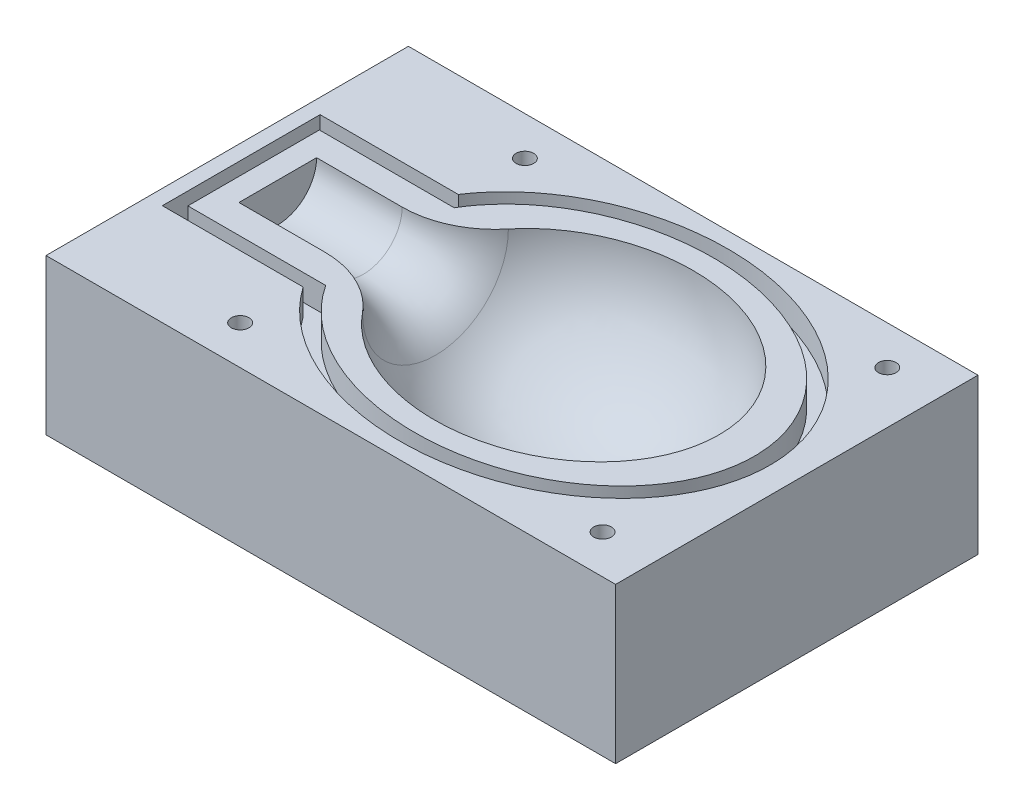
ISO-10303-21;
HEADER;
FILE_DESCRIPTION(('STEP AP214'),'2;1');
FILE_NAME('part.step','',(''),(''),'','','');
FILE_SCHEMA(('AUTOMOTIVE_DESIGN { 1 0 10303 214 1 1 1 1 }'));
ENDSEC;
DATA;
#1=APPLICATION_CONTEXT('core data for automotive mechanical design processes');
#2=APPLICATION_PROTOCOL_DEFINITION('international standard','automotive_design',2000,#1);
#3=PRODUCT_CONTEXT('',#1,'mechanical');
#4=PRODUCT('Part','Part','',(#3));
#5=PRODUCT_RELATED_PRODUCT_CATEGORY('part','',(#4));
#6=PRODUCT_DEFINITION_FORMATION('','',#4);
#7=PRODUCT_DEFINITION_CONTEXT('part definition',#1,'design');
#8=PRODUCT_DEFINITION('design','',#6,#7);
#9=PRODUCT_DEFINITION_SHAPE('','',#8);
#10=(LENGTH_UNIT() NAMED_UNIT(*) SI_UNIT(.MILLI.,.METRE.));
#11=(NAMED_UNIT(*) PLANE_ANGLE_UNIT() SI_UNIT($,.RADIAN.));
#12=(NAMED_UNIT(*) SI_UNIT($,.STERADIAN.) SOLID_ANGLE_UNIT());
#13=UNCERTAINTY_MEASURE_WITH_UNIT(LENGTH_MEASURE(1.E-05),#10,'distance_accuracy_value','');
#14=(GEOMETRIC_REPRESENTATION_CONTEXT(3) GLOBAL_UNCERTAINTY_ASSIGNED_CONTEXT((#13)) GLOBAL_UNIT_ASSIGNED_CONTEXT((#10,
#11,#12)) REPRESENTATION_CONTEXT('',''));
#15=CARTESIAN_POINT('',(0.,0.,0.));
#16=DIRECTION('',(0.,0.,1.));
#17=DIRECTION('',(1.,0.,0.));
#18=AXIS2_PLACEMENT_3D('',#15,#16,#17);
#19=CARTESIAN_POINT('',(-65.,15.,70.));
#20=DIRECTION('',(0.,-1.,0.));
#21=DIRECTION('',(0.,0.,-1.));
#22=AXIS2_PLACEMENT_3D('',#19,#20,#21);
#23=PLANE('',#22);
#24=CARTESIAN_POINT('',(-35.,15.,7.50000000000001));
#25=DIRECTION('',(0.,1.,0.));
#26=DIRECTION('',(0.,0.,1.));
#27=AXIS2_PLACEMENT_3D('',#24,#25,#26);
#28=CIRCLE('',#27,1.7);
#29=CARTESIAN_POINT('',(-35.,15.,9.20000000000001));
#30=VERTEX_POINT('',#29);
#31=EDGE_CURVE('E376',#30,#30,#28,.T.);
#32=ORIENTED_EDGE('',*,*,#31,.F.);
#33=EDGE_LOOP('',(#32));
#34=FACE_BOUND('',#33,.T.);
#35=CARTESIAN_POINT('',(-35.,15.,62.5));
#36=DIRECTION('',(0.,1.,0.));
#37=DIRECTION('',(0.,0.,1.));
#38=AXIS2_PLACEMENT_3D('',#35,#36,#37);
#39=CIRCLE('',#38,1.7);
#40=CARTESIAN_POINT('',(-35.,15.,64.2));
#41=VERTEX_POINT('',#40);
#42=EDGE_CURVE('E370',#41,#41,#39,.T.);
#43=ORIENTED_EDGE('',*,*,#42,.F.);
#44=EDGE_LOOP('',(#43));
#45=FACE_BOUND('',#44,.T.);
#46=CARTESIAN_POINT('',(35.,15.,62.5));
#47=DIRECTION('',(0.,1.,0.));
#48=DIRECTION('',(0.,0.,1.));
#49=AXIS2_PLACEMENT_3D('',#46,#47,#48);
#50=CIRCLE('',#49,1.7);
#51=CARTESIAN_POINT('',(35.,15.,64.2));
#52=VERTEX_POINT('',#51);
#53=EDGE_CURVE('E373',#52,#52,#50,.T.);
#54=ORIENTED_EDGE('',*,*,#53,.F.);
#55=EDGE_LOOP('',(#54));
#56=FACE_BOUND('',#55,.T.);
#57=CARTESIAN_POINT('',(35.,15.,7.50000000000001));
#58=DIRECTION('',(0.,1.,0.));
#59=DIRECTION('',(0.,0.,1.));
#60=AXIS2_PLACEMENT_3D('',#57,#58,#59);
#61=CIRCLE('',#60,1.7);
#62=CARTESIAN_POINT('',(35.,15.,9.20000000000001));
#63=VERTEX_POINT('',#62);
#64=EDGE_CURVE('E175',#63,#63,#61,.T.);
#65=ORIENTED_EDGE('',*,*,#64,.F.);
#66=EDGE_LOOP('',(#65));
#67=FACE_BOUND('',#66,.T.);
#68=CARTESIAN_POINT('',(-0.0005451086669871,15.,34.9611842694005));
#69=DIRECTION('',(0.,1.,0.));
#70=DIRECTION('',(0.999945324283841,0.,0.0104569805816109));
#71=AXIS2_PLACEMENT_3D('',#68,#69,#70);
#72=ELLIPSE('',#71,40.,31.9289069454393);
#73=CARTESIAN_POINT('',(-34.8996353722282,15.,50.4303053997574));
#74=VERTEX_POINT('',#73);
#75=CARTESIAN_POINT('',(-35.4015133834347,15.,19.9632950449526));
#76=VERTEX_POINT('',#75);
#77=EDGE_CURVE('E301',#74,#76,#72,.T.);
#78=ORIENTED_EDGE('',*,*,#77,.F.);
#79=DIRECTION('',(1.,0.,0.));
#80=VECTOR('',#79,1.);
#81=CARTESIAN_POINT('',(0.,15.,50.4303053997574));
#82=LINE('',#81,#80);
#83=CARTESIAN_POINT('',(-62.0942792060646,15.,50.4303053997575));
#84=VERTEX_POINT('',#83);
#85=EDGE_CURVE('E51',#84,#74,#82,.T.);
#86=ORIENTED_EDGE('',*,*,#85,.F.);
#87=DIRECTION('',(0.,0.,1.));
#88=VECTOR('',#87,1.);
#89=CARTESIAN_POINT('',(-62.0942792060646,15.,0.));
#90=LINE('',#89,#88);
#91=CARTESIAN_POINT('',(-62.0942792060646,15.,19.9632950449526));
#92=VERTEX_POINT('',#91);
#93=EDGE_CURVE('E295',#92,#84,#90,.T.);
#94=ORIENTED_EDGE('',*,*,#93,.F.);
#95=DIRECTION('',(-1.,0.,0.));
#96=VECTOR('',#95,1.);
#97=CARTESIAN_POINT('',(0.,15.,19.9632950449526));
#98=LINE('',#97,#96);
#99=EDGE_CURVE('E298',#76,#92,#98,.T.);
#100=ORIENTED_EDGE('',*,*,#99,.F.);
#101=EDGE_LOOP('',(#78,#86,#94,#100));
#102=FACE_BOUND('',#101,.T.);
#103=DIRECTION('',(-1.,0.,0.));
#104=VECTOR('',#103,1.);
#105=CARTESIAN_POINT('',(-65.,15.,70.));
#106=LINE('',#105,#104);
#107=CARTESIAN_POINT('',(45.0269621580825,15.,70.));
#108=VERTEX_POINT('',#107);
#109=CARTESIAN_POINT('',(-65.,15.,70.));
#110=VERTEX_POINT('',#109);
#111=EDGE_CURVE('E221',#108,#110,#106,.T.);
#112=ORIENTED_EDGE('',*,*,#111,.F.);
#113=DIRECTION('',(0.,0.,-1.));
#114=VECTOR('',#113,1.);
#115=CARTESIAN_POINT('',(45.0269621580825,15.,70.));
#116=LINE('',#115,#114);
#117=CARTESIAN_POINT('',(45.0269621580825,15.,0.));
#118=VERTEX_POINT('',#117);
#119=EDGE_CURVE('E266',#108,#118,#116,.T.);
#120=ORIENTED_EDGE('',*,*,#119,.T.);
#121=DIRECTION('',(-1.,0.,0.));
#122=VECTOR('',#121,1.);
#123=CARTESIAN_POINT('',(-65.,15.,0.));
#124=LINE('',#123,#122);
#125=CARTESIAN_POINT('',(-65.,15.,0.));
#126=VERTEX_POINT('',#125);
#127=EDGE_CURVE('E218',#118,#126,#124,.T.);
#128=ORIENTED_EDGE('',*,*,#127,.T.);
#129=DIRECTION('',(0.,0.,-1.));
#130=VECTOR('',#129,1.);
#131=CARTESIAN_POINT('',(-65.,15.,70.));
#132=LINE('',#131,#130);
#133=EDGE_CURVE('E237',#110,#126,#132,.T.);
#134=ORIENTED_EDGE('',*,*,#133,.F.);
#135=EDGE_LOOP('',(#112,#120,#128,#134));
#136=FACE_BOUND('',#135,.T.);
#137=ADVANCED_FACE('F36',(#34,#45,#56,#67,#102,#136),#23,.F.);
#138=CARTESIAN_POINT('',(-65.,-15.,70.));
#139=DIRECTION('',(1.,0.,0.));
#140=DIRECTION('',(0.,0.,-1.));
#141=AXIS2_PLACEMENT_3D('',#138,#139,#140);
#142=PLANE('',#141);
#143=DIRECTION('',(0.,-1.,0.));
#144=VECTOR('',#143,1.);
#145=CARTESIAN_POINT('',(-65.,-15.,0.));
#146=LINE('',#145,#144);
#147=CARTESIAN_POINT('',(-65.,-15.,0.));
#148=VERTEX_POINT('',#147);
#149=EDGE_CURVE('E231',#126,#148,#146,.T.);
#150=ORIENTED_EDGE('',*,*,#149,.T.);
#151=DIRECTION('',(0.,0.,-1.));
#152=VECTOR('',#151,1.);
#153=CARTESIAN_POINT('',(-65.,-15.,70.));
#154=LINE('',#153,#152);
#155=CARTESIAN_POINT('',(-65.,-15.,70.));
#156=VERTEX_POINT('',#155);
#157=EDGE_CURVE('E229',#156,#148,#154,.T.);
#158=ORIENTED_EDGE('',*,*,#157,.F.);
#159=DIRECTION('',(0.,-1.,0.));
#160=VECTOR('',#159,1.);
#161=CARTESIAN_POINT('',(-65.,-15.,70.));
#162=LINE('',#161,#160);
#163=EDGE_CURVE('E223',#110,#156,#162,.T.);
#164=ORIENTED_EDGE('',*,*,#163,.F.);
#165=ORIENTED_EDGE('',*,*,#133,.T.);
#166=EDGE_LOOP('',(#150,#158,#164,#165));
#167=FACE_BOUND('',#166,.T.);
#168=ADVANCED_FACE('F330',(#167),#142,.F.);
#169=CARTESIAN_POINT('',(-65.,-15.,70.));
#170=DIRECTION('',(0.,1.,0.));
#171=DIRECTION('',(0.,0.,1.));
#172=AXIS2_PLACEMENT_3D('',#169,#170,#171);
#173=PLANE('',#172);
#174=CARTESIAN_POINT('',(-35.,-15.,7.50000000000001));
#175=DIRECTION('',(0.,1.,0.));
#176=DIRECTION('',(0.,0.,1.));
#177=AXIS2_PLACEMENT_3D('',#174,#175,#176);
#178=CIRCLE('',#177,1.7);
#179=CARTESIAN_POINT('',(-35.,-15.,9.20000000000001));
#180=VERTEX_POINT('',#179);
#181=EDGE_CURVE('E371',#180,#180,#178,.T.);
#182=ORIENTED_EDGE('',*,*,#181,.T.);
#183=EDGE_LOOP('',(#182));
#184=FACE_BOUND('',#183,.T.);
#185=CARTESIAN_POINT('',(-35.,-15.,62.5));
#186=DIRECTION('',(0.,1.,0.));
#187=DIRECTION('',(0.,0.,1.));
#188=AXIS2_PLACEMENT_3D('',#185,#186,#187);
#189=CIRCLE('',#188,1.7);
#190=CARTESIAN_POINT('',(-35.,-15.,64.2));
#191=VERTEX_POINT('',#190);
#192=EDGE_CURVE('E367',#191,#191,#189,.T.);
#193=ORIENTED_EDGE('',*,*,#192,.T.);
#194=EDGE_LOOP('',(#193));
#195=FACE_BOUND('',#194,.T.);
#196=CARTESIAN_POINT('',(35.,-15.,62.5));
#197=DIRECTION('',(0.,1.,0.));
#198=DIRECTION('',(0.,0.,1.));
#199=AXIS2_PLACEMENT_3D('',#196,#197,#198);
#200=CIRCLE('',#199,1.7);
#201=CARTESIAN_POINT('',(35.,-15.,64.2));
#202=VERTEX_POINT('',#201);
#203=EDGE_CURVE('E384',#202,#202,#200,.T.);
#204=ORIENTED_EDGE('',*,*,#203,.T.);
#205=EDGE_LOOP('',(#204));
#206=FACE_BOUND('',#205,.T.);
#207=CARTESIAN_POINT('',(35.,-15.,7.50000000000001));
#208=DIRECTION('',(0.,1.,0.));
#209=DIRECTION('',(0.,0.,1.));
#210=AXIS2_PLACEMENT_3D('',#207,#208,#209);
#211=CIRCLE('',#210,1.7);
#212=CARTESIAN_POINT('',(35.,-15.,9.20000000000001));
#213=VERTEX_POINT('',#212);
#214=EDGE_CURVE('E304',#213,#213,#211,.T.);
#215=ORIENTED_EDGE('',*,*,#214,.T.);
#216=EDGE_LOOP('',(#215));
#217=FACE_BOUND('',#216,.T.);
#218=DIRECTION('',(1.,0.,0.));
#219=VECTOR('',#218,1.);
#220=CARTESIAN_POINT('',(-65.,-15.,0.));
#221=LINE('',#220,#219);
#222=CARTESIAN_POINT('',(45.0269621580825,-15.,0.));
#223=VERTEX_POINT('',#222);
#224=EDGE_CURVE('E224',#148,#223,#221,.T.);
#225=ORIENTED_EDGE('',*,*,#224,.T.);
#226=DIRECTION('',(0.,0.,-1.));
#227=VECTOR('',#226,1.);
#228=CARTESIAN_POINT('',(45.0269621580825,-15.,70.));
#229=LINE('',#228,#227);
#230=CARTESIAN_POINT('',(45.0269621580825,-15.,70.));
#231=VERTEX_POINT('',#230);
#232=EDGE_CURVE('E267',#231,#223,#229,.T.);
#233=ORIENTED_EDGE('',*,*,#232,.F.);
#234=DIRECTION('',(1.,0.,0.));
#235=VECTOR('',#234,1.);
#236=CARTESIAN_POINT('',(-65.,-15.,70.));
#237=LINE('',#236,#235);
#238=EDGE_CURVE('E226',#156,#231,#237,.T.);
#239=ORIENTED_EDGE('',*,*,#238,.F.);
#240=ORIENTED_EDGE('',*,*,#157,.T.);
#241=EDGE_LOOP('',(#225,#233,#239,#240));
#242=FACE_BOUND('',#241,.T.);
#243=ADVANCED_FACE('F335',(#184,#195,#206,#217,#242),#173,.F.);
#244=CARTESIAN_POINT('',(0.,0.,70.));
#245=DIRECTION('',(0.,0.,-1.));
#246=DIRECTION('',(-1.,0.,0.));
#247=AXIS2_PLACEMENT_3D('',#244,#245,#246);
#248=PLANE('',#247);
#249=ORIENTED_EDGE('',*,*,#238,.T.);
#250=DIRECTION('',(0.,1.,0.));
#251=VECTOR('',#250,1.);
#252=CARTESIAN_POINT('',(45.0269621580825,15.,70.));
#253=LINE('',#252,#251);
#254=EDGE_CURVE('E269',#231,#108,#253,.T.);
#255=ORIENTED_EDGE('',*,*,#254,.T.);
#256=ORIENTED_EDGE('',*,*,#111,.T.);
#257=ORIENTED_EDGE('',*,*,#163,.T.);
#258=EDGE_LOOP('',(#249,#255,#256,#257));
#259=FACE_BOUND('',#258,.T.);
#260=ADVANCED_FACE('F211',(#259),#248,.F.);
#261=CARTESIAN_POINT('',(0.,0.,0.));
#262=DIRECTION('',(0.,0.,-1.));
#263=DIRECTION('',(-1.,0.,0.));
#264=AXIS2_PLACEMENT_3D('',#261,#262,#263);
#265=PLANE('',#264);
#266=DIRECTION('',(0.,1.,0.));
#267=VECTOR('',#266,1.);
#268=CARTESIAN_POINT('',(45.0269621580825,15.,0.));
#269=LINE('',#268,#267);
#270=EDGE_CURVE('E272',#223,#118,#269,.T.);
#271=ORIENTED_EDGE('',*,*,#270,.F.);
#272=ORIENTED_EDGE('',*,*,#224,.F.);
#273=ORIENTED_EDGE('',*,*,#149,.F.);
#274=ORIENTED_EDGE('',*,*,#127,.F.);
#275=EDGE_LOOP('',(#271,#272,#273,#274));
#276=FACE_BOUND('',#275,.T.);
#277=ADVANCED_FACE('F195',(#276),#265,.T.);
#278=CARTESIAN_POINT('',(45.0269621580825,15.,70.));
#279=DIRECTION('',(-1.,0.,0.));
#280=DIRECTION('',(0.,0.,1.));
#281=AXIS2_PLACEMENT_3D('',#278,#279,#280);
#282=PLANE('',#281);
#283=ORIENTED_EDGE('',*,*,#270,.T.);
#284=ORIENTED_EDGE('',*,*,#119,.F.);
#285=ORIENTED_EDGE('',*,*,#254,.F.);
#286=ORIENTED_EDGE('',*,*,#232,.T.);
#287=EDGE_LOOP('',(#283,#284,#285,#286));
#288=FACE_BOUND('',#287,.T.);
#289=ADVANCED_FACE('F191',(#288),#282,.F.);
#290=CARTESIAN_POINT('',(0.,10.,47.9921098960602));
#291=DIRECTION('',(0.,0.,1.));
#292=DIRECTION('',(1.,0.,0.));
#293=AXIS2_PLACEMENT_3D('',#290,#291,#292);
#294=PLANE('',#293);
#295=DIRECTION('',(1.,0.,0.));
#296=VECTOR('',#295,1.);
#297=CARTESIAN_POINT('',(0.,15.,47.9921098960602));
#298=LINE('',#297,#296);
#299=CARTESIAN_POINT('',(-59.6000156142509,15.,47.9921098960602));
#300=VERTEX_POINT('',#299);
#301=CARTESIAN_POINT('',(-32.9697629998158,15.,47.9921098960602));
#302=VERTEX_POINT('',#301);
#303=EDGE_CURVE('E59',#300,#302,#298,.T.);
#304=ORIENTED_EDGE('',*,*,#303,.F.);
#305=DIRECTION('',(0.,1.,0.));
#306=VECTOR('',#305,1.);
#307=CARTESIAN_POINT('',(-59.6000156142509,10.,47.9921098960602));
#308=LINE('',#307,#306);
#309=CARTESIAN_POINT('',(-59.6000156142509,10.,47.9921098960602));
#310=VERTEX_POINT('',#309);
#311=EDGE_CURVE('E282',#310,#300,#308,.T.);
#312=ORIENTED_EDGE('',*,*,#311,.F.);
#313=DIRECTION('',(1.,0.,0.));
#314=VECTOR('',#313,1.);
#315=CARTESIAN_POINT('',(0.,10.,47.9921098960602));
#316=LINE('',#315,#314);
#317=CARTESIAN_POINT('',(-32.9697629998158,10.,47.9921098960602));
#318=VERTEX_POINT('',#317);
#319=EDGE_CURVE('E559',#310,#318,#316,.T.);
#320=ORIENTED_EDGE('',*,*,#319,.T.);
#321=DIRECTION('',(0.,1.,0.));
#322=VECTOR('',#321,1.);
#323=CARTESIAN_POINT('',(-32.9697629998158,10.,47.9921098960602));
#324=LINE('',#323,#322);
#325=EDGE_CURVE('E274',#318,#302,#324,.T.);
#326=ORIENTED_EDGE('',*,*,#325,.T.);
#327=EDGE_LOOP('',(#304,#312,#320,#326));
#328=FACE_BOUND('',#327,.T.);
#329=ADVANCED_FACE('F194',(#328),#294,.T.);
#330=CARTESIAN_POINT('',(-0.0005451086669871,10.,34.9611842694005));
#331=DIRECTION('',(0.,1.,0.));
#332=DIRECTION('',(0.999929789833082,0.,0.0118497006024825));
#333=AXIS2_PLACEMENT_3D('',#330,#331,#332);
#334=ELLIPSE('',#333,37.,29.0423648011549);
#335=DIRECTION('',(0.,1.,0.));
#336=VECTOR('',#335,1.);
#337=SURFACE_OF_LINEAR_EXTRUSION('',#334,#336);
#338=CARTESIAN_POINT('',(-0.0005451086669871,15.,34.9611842694005));
#339=DIRECTION('',(0.,1.,0.));
#340=DIRECTION('',(0.999929789833082,0.,0.0118497006024825));
#341=AXIS2_PLACEMENT_3D('',#338,#339,#340);
#342=ELLIPSE('',#341,37.,29.0423648011549);
#343=CARTESIAN_POINT('',(-33.5682160713727,15.,22.5937319526608));
#344=VERTEX_POINT('',#343);
#345=EDGE_CURVE('E169',#302,#344,#342,.T.);
#346=ORIENTED_EDGE('',*,*,#345,.F.);
#347=ORIENTED_EDGE('',*,*,#325,.F.);
#348=CARTESIAN_POINT('',(-33.5682160713727,10.,22.5937319526608));
#349=VERTEX_POINT('',#348);
#350=EDGE_CURVE('E155',#318,#349,#334,.T.);
#351=ORIENTED_EDGE('',*,*,#350,.T.);
#352=DIRECTION('',(0.,1.,0.));
#353=VECTOR('',#352,1.);
#354=CARTESIAN_POINT('',(-33.5682160713727,10.,22.5937319526608));
#355=LINE('',#354,#353);
#356=EDGE_CURVE('E286',#349,#344,#355,.T.);
#357=ORIENTED_EDGE('',*,*,#356,.T.);
#358=EDGE_LOOP('',(#346,#347,#351,#357));
#359=FACE_BOUND('',#358,.T.);
#360=ADVANCED_FACE('F310',(#359),#337,.T.);
#361=CARTESIAN_POINT('',(0.,10.,22.5937319526608));
#362=DIRECTION('',(0.,0.,-1.));
#363=DIRECTION('',(-1.,0.,0.));
#364=AXIS2_PLACEMENT_3D('',#361,#362,#363);
#365=PLANE('',#364);
#366=DIRECTION('',(-1.,0.,0.));
#367=VECTOR('',#366,1.);
#368=CARTESIAN_POINT('',(0.,15.,22.5937319526608));
#369=LINE('',#368,#367);
#370=CARTESIAN_POINT('',(-59.6000156142509,15.,22.5937319526608));
#371=VERTEX_POINT('',#370);
#372=EDGE_CURVE('E172',#344,#371,#369,.T.);
#373=ORIENTED_EDGE('',*,*,#372,.F.);
#374=ORIENTED_EDGE('',*,*,#356,.F.);
#375=DIRECTION('',(-1.,0.,0.));
#376=VECTOR('',#375,1.);
#377=CARTESIAN_POINT('',(0.,10.,22.5937319526608));
#378=LINE('',#377,#376);
#379=CARTESIAN_POINT('',(-59.6000156142509,10.,22.5937319526608));
#380=VERTEX_POINT('',#379);
#381=EDGE_CURVE('E307',#349,#380,#378,.T.);
#382=ORIENTED_EDGE('',*,*,#381,.T.);
#383=DIRECTION('',(0.,1.,0.));
#384=VECTOR('',#383,1.);
#385=CARTESIAN_POINT('',(-59.6000156142509,10.,22.5937319526608));
#386=LINE('',#385,#384);
#387=EDGE_CURVE('E284',#380,#371,#386,.T.);
#388=ORIENTED_EDGE('',*,*,#387,.T.);
#389=EDGE_LOOP('',(#373,#374,#382,#388));
#390=FACE_BOUND('',#389,.T.);
#391=ADVANCED_FACE('F190',(#390),#365,.T.);
#392=CARTESIAN_POINT('',(0.,10.,50.4303053997574));
#393=DIRECTION('',(0.,0.,1.));
#394=DIRECTION('',(1.,0.,0.));
#395=AXIS2_PLACEMENT_3D('',#392,#393,#394);
#396=PLANE('',#395);
#397=ORIENTED_EDGE('',*,*,#85,.T.);
#398=DIRECTION('',(0.,1.,0.));
#399=VECTOR('',#398,1.);
#400=CARTESIAN_POINT('',(-34.8996353722282,10.,50.4303053997574));
#401=LINE('',#400,#399);
#402=CARTESIAN_POINT('',(-34.8996353722282,10.,50.4303053997574));
#403=VERTEX_POINT('',#402);
#404=EDGE_CURVE('E145',#403,#74,#401,.T.);
#405=ORIENTED_EDGE('',*,*,#404,.F.);
#406=DIRECTION('',(1.,0.,0.));
#407=VECTOR('',#406,1.);
#408=CARTESIAN_POINT('',(0.,10.,50.4303053997574));
#409=LINE('',#408,#407);
#410=CARTESIAN_POINT('',(-62.0942792060646,10.,50.4303053997575));
#411=VERTEX_POINT('',#410);
#412=EDGE_CURVE('E149',#411,#403,#409,.T.);
#413=ORIENTED_EDGE('',*,*,#412,.F.);
#414=DIRECTION('',(0.,1.,0.));
#415=VECTOR('',#414,1.);
#416=CARTESIAN_POINT('',(-62.0942792060646,10.,50.4303053997575));
#417=LINE('',#416,#415);
#418=EDGE_CURVE('E280',#411,#84,#417,.T.);
#419=ORIENTED_EDGE('',*,*,#418,.T.);
#420=EDGE_LOOP('',(#397,#405,#413,#419));
#421=FACE_BOUND('',#420,.T.);
#422=ADVANCED_FACE('F147',(#421),#396,.F.);
#423=CARTESIAN_POINT('',(-62.0942792060646,10.,0.));
#424=DIRECTION('',(-1.,0.,0.));
#425=DIRECTION('',(0.,0.,1.));
#426=AXIS2_PLACEMENT_3D('',#423,#424,#425);
#427=PLANE('',#426);
#428=ORIENTED_EDGE('',*,*,#93,.T.);
#429=ORIENTED_EDGE('',*,*,#418,.F.);
#430=DIRECTION('',(0.,0.,1.));
#431=VECTOR('',#430,1.);
#432=CARTESIAN_POINT('',(-62.0942792060646,10.,0.));
#433=LINE('',#432,#431);
#434=CARTESIAN_POINT('',(-62.0942792060646,10.,19.9632950449526));
#435=VERTEX_POINT('',#434);
#436=EDGE_CURVE('E168',#435,#411,#433,.T.);
#437=ORIENTED_EDGE('',*,*,#436,.F.);
#438=DIRECTION('',(0.,1.,0.));
#439=VECTOR('',#438,1.);
#440=CARTESIAN_POINT('',(-62.0942792060646,10.,19.9632950449526));
#441=LINE('',#440,#439);
#442=EDGE_CURVE('E278',#435,#92,#441,.T.);
#443=ORIENTED_EDGE('',*,*,#442,.T.);
#444=EDGE_LOOP('',(#428,#429,#437,#443));
#445=FACE_BOUND('',#444,.T.);
#446=ADVANCED_FACE('F189',(#445),#427,.F.);
#447=CARTESIAN_POINT('',(0.,10.,19.9632950449526));
#448=DIRECTION('',(0.,0.,-1.));
#449=DIRECTION('',(-1.,0.,0.));
#450=AXIS2_PLACEMENT_3D('',#447,#448,#449);
#451=PLANE('',#450);
#452=ORIENTED_EDGE('',*,*,#99,.T.);
#453=ORIENTED_EDGE('',*,*,#442,.F.);
#454=DIRECTION('',(-1.,0.,0.));
#455=VECTOR('',#454,1.);
#456=CARTESIAN_POINT('',(0.,10.,19.9632950449526));
#457=LINE('',#456,#455);
#458=CARTESIAN_POINT('',(-35.4015133834347,10.,19.9632950449526));
#459=VERTEX_POINT('',#458);
#460=EDGE_CURVE('E163',#459,#435,#457,.T.);
#461=ORIENTED_EDGE('',*,*,#460,.F.);
#462=DIRECTION('',(0.,1.,0.));
#463=VECTOR('',#462,1.);
#464=CARTESIAN_POINT('',(-35.4015133834347,10.,19.9632950449526));
#465=LINE('',#464,#463);
#466=EDGE_CURVE('E154',#459,#76,#465,.T.);
#467=ORIENTED_EDGE('',*,*,#466,.T.);
#468=EDGE_LOOP('',(#452,#453,#461,#467));
#469=FACE_BOUND('',#468,.T.);
#470=ADVANCED_FACE('F185',(#469),#451,.F.);
#471=CARTESIAN_POINT('',(-0.0005451086669871,10.,34.9611842694005));
#472=DIRECTION('',(0.,1.,0.));
#473=DIRECTION('',(0.999945324283841,0.,0.0104569805816109));
#474=AXIS2_PLACEMENT_3D('',#471,#472,#473);
#475=ELLIPSE('',#474,40.,31.9289069454393);
#476=DIRECTION('',(0.,1.,0.));
#477=VECTOR('',#476,1.);
#478=SURFACE_OF_LINEAR_EXTRUSION('',#475,#477);
#479=ORIENTED_EDGE('',*,*,#77,.T.);
#480=ORIENTED_EDGE('',*,*,#466,.F.);
#481=EDGE_CURVE('E158',#403,#459,#475,.T.);
#482=ORIENTED_EDGE('',*,*,#481,.F.);
#483=ORIENTED_EDGE('',*,*,#404,.T.);
#484=EDGE_LOOP('',(#479,#480,#482,#483));
#485=FACE_BOUND('',#484,.T.);
#486=ADVANCED_FACE('F159',(#485),#478,.F.);
#487=CARTESIAN_POINT('',(-59.6000156142509,10.,0.));
#488=DIRECTION('',(-1.,0.,0.));
#489=DIRECTION('',(0.,0.,1.));
#490=AXIS2_PLACEMENT_3D('',#487,#488,#489);
#491=PLANE('',#490);
#492=DIRECTION('',(0.,0.,1.));
#493=VECTOR('',#492,1.);
#494=CARTESIAN_POINT('',(-59.6000156142509,15.,0.));
#495=LINE('',#494,#493);
#496=EDGE_CURVE('E291',#371,#300,#495,.T.);
#497=ORIENTED_EDGE('',*,*,#496,.F.);
#498=ORIENTED_EDGE('',*,*,#387,.F.);
#499=DIRECTION('',(0.,0.,1.));
#500=VECTOR('',#499,1.);
#501=CARTESIAN_POINT('',(-59.6000156142509,10.,0.));
#502=LINE('',#501,#500);
#503=EDGE_CURVE('E561',#380,#310,#502,.T.);
#504=ORIENTED_EDGE('',*,*,#503,.T.);
#505=ORIENTED_EDGE('',*,*,#311,.T.);
#506=EDGE_LOOP('',(#497,#498,#504,#505));
#507=FACE_BOUND('',#506,.T.);
#508=ADVANCED_FACE('F184',(#507),#491,.T.);
#509=CARTESIAN_POINT('',(0.,10.,0.));
#510=DIRECTION('',(0.,1.,0.));
#511=DIRECTION('',(0.,0.,1.));
#512=AXIS2_PLACEMENT_3D('',#509,#510,#511);
#513=PLANE('',#512);
#514=ORIENTED_EDGE('',*,*,#412,.T.);
#515=ORIENTED_EDGE('',*,*,#481,.T.);
#516=ORIENTED_EDGE('',*,*,#460,.T.);
#517=ORIENTED_EDGE('',*,*,#436,.T.);
#518=EDGE_LOOP('',(#514,#515,#516,#517));
#519=FACE_BOUND('',#518,.T.);
#520=ORIENTED_EDGE('',*,*,#319,.F.);
#521=ORIENTED_EDGE('',*,*,#503,.F.);
#522=ORIENTED_EDGE('',*,*,#381,.F.);
#523=ORIENTED_EDGE('',*,*,#350,.F.);
#524=EDGE_LOOP('',(#520,#521,#522,#523));
#525=FACE_BOUND('',#524,.T.);
#526=ADVANCED_FACE('F165',(#519,#525),#513,.T.);
#527=CARTESIAN_POINT('',(-55.2372772862499,15.,35.));
#528=DIRECTION('',(1.,0.,0.));
#529=DIRECTION('',(0.,0.,-1.));
#530=AXIS2_PLACEMENT_3D('',#527,#528,#529);
#531=PLANE('',#530);
#532=DIRECTION('',(0.,0.,1.));
#533=VECTOR('',#532,1.);
#534=CARTESIAN_POINT('',(-55.2372772862499,15.,35.));
#535=LINE('',#534,#533);
#536=CARTESIAN_POINT('',(-55.2372772862499,15.,27.5));
#537=VERTEX_POINT('',#536);
#538=CARTESIAN_POINT('',(-55.2372772862499,15.,42.5));
#539=VERTEX_POINT('',#538);
#540=EDGE_CURVE('E261',#537,#539,#535,.T.);
#541=ORIENTED_EDGE('',*,*,#540,.T.);
#542=CARTESIAN_POINT('',(-55.2372772862499,15.,35.));
#543=DIRECTION('',(1.,0.,0.));
#544=DIRECTION('',(0.,0.,-1.));
#545=AXIS2_PLACEMENT_3D('',#542,#543,#544);
#546=CIRCLE('',#545,7.5);
#547=EDGE_CURVE('E255',#539,#537,#546,.T.);
#548=ORIENTED_EDGE('',*,*,#547,.T.);
#549=EDGE_LOOP('',(#541,#548));
#550=FACE_BOUND('',#549,.T.);
#551=ADVANCED_FACE('F197',(#550),#531,.T.);
#552=CARTESIAN_POINT('',(0.,15.,35.));
#553=DIRECTION('',(0.,-1.,0.));
#554=DIRECTION('',(1.,0.,0.));
#555=AXIS2_PLACEMENT_3D('',#552,#553,#554);
#556=ELLIPSE('',#555,30.,25.);
#557=TRIMMED_CURVE('',#556,(PARAMETER_VALUE(0.)),(PARAMETER_VALUE(3.14159265358979)),.T.,.PARAMETER.);
#558=CARTESIAN_POINT('',(65.,15.,35.));
#559=DIRECTION('',(1.,0.,0.));
#560=AXIS1_PLACEMENT('',#558,#559);
#561=SURFACE_OF_REVOLUTION('',#557,#560);
#562=CARTESIAN_POINT('',(0.,15.,35.));
#563=DIRECTION('',(0.,1.,0.));
#564=DIRECTION('',(1.,0.,0.));
#565=AXIS2_PLACEMENT_3D('',#562,#563,#564);
#566=ELLIPSE('',#565,30.,25.);
#567=CARTESIAN_POINT('',(30.,15.,35.));
#568=VERTEX_POINT('',#567);
#569=CARTESIAN_POINT('',(-24.7780602253039,15.,20.9058786025477));
#570=VERTEX_POINT('',#569);
#571=EDGE_CURVE('E219',#568,#570,#566,.T.);
#572=ORIENTED_EDGE('',*,*,#571,.T.);
#573=CARTESIAN_POINT('',(-24.7780602253039,15.,35.));
#574=DIRECTION('',(1.,0.,0.));
#575=DIRECTION('',(0.,0.,-1.));
#576=AXIS2_PLACEMENT_3D('',#573,#574,#575);
#577=CIRCLE('',#576,14.0941213974523);
#578=CARTESIAN_POINT('',(-24.7780602253039,15.0000000000001,49.0941213974523));
#579=VERTEX_POINT('',#578);
#580=EDGE_CURVE('E11',#570,#579,#577,.F.);
#581=ORIENTED_EDGE('',*,*,#580,.T.);
#582=EDGE_CURVE('E213',#568,#579,#556,.T.);
#583=ORIENTED_EDGE('',*,*,#582,.F.);
#584=EDGE_LOOP('',(#572,#581,#583));
#585=FACE_BOUND('',#584,.T.);
#586=ADVANCED_FACE('F200',(#585),#561,.T.);
#587=CARTESIAN_POINT('',(-38.703071295459,15.,35.));
#588=DIRECTION('',(-1.,0.,0.));
#589=DIRECTION('',(0.,0.,1.));
#590=AXIS2_PLACEMENT_3D('',#587,#588,#589);
#591=TOROIDAL_SURFACE('',#590,25.5,18.);
#592=CARTESIAN_POINT('',(-38.703071295459,15.,60.5));
#593=DIRECTION('',(0.,-1.,0.));
#594=DIRECTION('',(0.,0.,-1.));
#595=AXIS2_PLACEMENT_3D('',#592,#593,#594);
#596=CIRCLE('',#595,18.);
#597=CARTESIAN_POINT('',(-38.703071295459,15.,42.5));
#598=VERTEX_POINT('',#597);
#599=EDGE_CURVE('E243',#579,#598,#596,.F.);
#600=ORIENTED_EDGE('',*,*,#599,.F.);
#601=ORIENTED_EDGE('',*,*,#580,.F.);
#602=CARTESIAN_POINT('',(-38.703071295459,15.,9.50000000000001));
#603=DIRECTION('',(0.,-1.,0.));
#604=DIRECTION('',(0.,0.,-1.));
#605=AXIS2_PLACEMENT_3D('',#602,#603,#604);
#606=CIRCLE('',#605,18.);
#607=CARTESIAN_POINT('',(-38.703071295459,15.,27.5));
#608=VERTEX_POINT('',#607);
#609=EDGE_CURVE('E44',#608,#570,#606,.F.);
#610=ORIENTED_EDGE('',*,*,#609,.F.);
#611=CARTESIAN_POINT('',(-38.703071295459,15.,35.));
#612=DIRECTION('',(-1.,0.,0.));
#613=DIRECTION('',(0.,0.,1.));
#614=AXIS2_PLACEMENT_3D('',#611,#612,#613);
#615=CIRCLE('',#614,7.5);
#616=EDGE_CURVE('E240',#598,#608,#615,.F.);
#617=ORIENTED_EDGE('',*,*,#616,.F.);
#618=EDGE_LOOP('',(#600,#601,#610,#617));
#619=FACE_BOUND('',#618,.T.);
#620=ADVANCED_FACE('F38',(#619),#591,.T.);
#621=CARTESIAN_POINT('',(-15.6444250967667,15.,35.));
#622=DIRECTION('',(1.,0.,0.));
#623=DIRECTION('',(0.,0.,-1.));
#624=AXIS2_PLACEMENT_3D('',#621,#622,#623);
#625=CYLINDRICAL_SURFACE('',#624,7.5);
#626=DIRECTION('',(1.,0.,0.));
#627=VECTOR('',#626,1.);
#628=CARTESIAN_POINT('',(-15.6444250967667,15.,42.5));
#629=LINE('',#628,#627);
#630=EDGE_CURVE('E259',#539,#598,#629,.T.);
#631=ORIENTED_EDGE('',*,*,#630,.T.);
#632=ORIENTED_EDGE('',*,*,#616,.T.);
#633=DIRECTION('',(1.,0.,0.));
#634=VECTOR('',#633,1.);
#635=CARTESIAN_POINT('',(-15.6444250967667,15.,27.5));
#636=LINE('',#635,#634);
#637=EDGE_CURVE('E251',#537,#608,#636,.T.);
#638=ORIENTED_EDGE('',*,*,#637,.F.);
#639=ORIENTED_EDGE('',*,*,#547,.F.);
#640=EDGE_LOOP('',(#631,#632,#638,#639));
#641=FACE_BOUND('',#640,.T.);
#642=ADVANCED_FACE('F202',(#641),#625,.F.);
#643=ORIENTED_EDGE('',*,*,#637,.T.);
#644=ORIENTED_EDGE('',*,*,#609,.T.);
#645=ORIENTED_EDGE('',*,*,#571,.F.);
#646=ORIENTED_EDGE('',*,*,#582,.T.);
#647=ORIENTED_EDGE('',*,*,#599,.T.);
#648=ORIENTED_EDGE('',*,*,#630,.F.);
#649=ORIENTED_EDGE('',*,*,#540,.F.);
#650=EDGE_LOOP('',(#643,#644,#645,#646,#647,#648,#649));
#651=FACE_BOUND('',#650,.T.);
#652=ORIENTED_EDGE('',*,*,#303,.T.);
#653=ORIENTED_EDGE('',*,*,#345,.T.);
#654=ORIENTED_EDGE('',*,*,#372,.T.);
#655=ORIENTED_EDGE('',*,*,#496,.T.);
#656=EDGE_LOOP('',(#652,#653,#654,#655));
#657=FACE_BOUND('',#656,.T.);
#658=ADVANCED_FACE('F205',(#651,#657),#23,.F.);
#659=CARTESIAN_POINT('',(35.,-15.,7.50000000000001));
#660=DIRECTION('',(0.,1.,0.));
#661=DIRECTION('',(0.,0.,1.));
#662=AXIS2_PLACEMENT_3D('',#659,#660,#661);
#663=CYLINDRICAL_SURFACE('',#662,1.7);
#664=ORIENTED_EDGE('',*,*,#214,.F.);
#665=EDGE_LOOP('',(#664));
#666=FACE_BOUND('',#665,.T.);
#667=ORIENTED_EDGE('',*,*,#64,.T.);
#668=EDGE_LOOP('',(#667));
#669=FACE_BOUND('',#668,.T.);
#670=ADVANCED_FACE('F341',(#666,#669),#663,.F.);
#671=CARTESIAN_POINT('',(35.,-15.,62.5));
#672=DIRECTION('',(0.,1.,0.));
#673=DIRECTION('',(0.,0.,1.));
#674=AXIS2_PLACEMENT_3D('',#671,#672,#673);
#675=CYLINDRICAL_SURFACE('',#674,1.7);
#676=ORIENTED_EDGE('',*,*,#203,.F.);
#677=EDGE_LOOP('',(#676));
#678=FACE_BOUND('',#677,.T.);
#679=ORIENTED_EDGE('',*,*,#53,.T.);
#680=EDGE_LOOP('',(#679));
#681=FACE_BOUND('',#680,.T.);
#682=ADVANCED_FACE('F345',(#678,#681),#675,.F.);
#683=CARTESIAN_POINT('',(-35.,-15.,62.5));
#684=DIRECTION('',(0.,1.,0.));
#685=DIRECTION('',(0.,0.,1.));
#686=AXIS2_PLACEMENT_3D('',#683,#684,#685);
#687=CYLINDRICAL_SURFACE('',#686,1.7);
#688=ORIENTED_EDGE('',*,*,#192,.F.);
#689=EDGE_LOOP('',(#688));
#690=FACE_BOUND('',#689,.T.);
#691=ORIENTED_EDGE('',*,*,#42,.T.);
#692=EDGE_LOOP('',(#691));
#693=FACE_BOUND('',#692,.T.);
#694=ADVANCED_FACE('F350',(#690,#693),#687,.F.);
#695=CARTESIAN_POINT('',(-35.,-15.,7.50000000000001));
#696=DIRECTION('',(0.,1.,0.));
#697=DIRECTION('',(0.,0.,1.));
#698=AXIS2_PLACEMENT_3D('',#695,#696,#697);
#699=CYLINDRICAL_SURFACE('',#698,1.7);
#700=ORIENTED_EDGE('',*,*,#181,.F.);
#701=EDGE_LOOP('',(#700));
#702=FACE_BOUND('',#701,.T.);
#703=ORIENTED_EDGE('',*,*,#31,.T.);
#704=EDGE_LOOP('',(#703));
#705=FACE_BOUND('',#704,.T.);
#706=ADVANCED_FACE('F356',(#702,#705),#699,.F.);
#707=CLOSED_SHELL('',(#137,#168,#243,#260,#277,#289,#329,#360,#391,#422,#446,#470,#486,#508,
#526,#551,#586,#620,#642,#658,#670,#682,#694,#706));
#708=MANIFOLD_SOLID_BREP('B2',#707);
#709=ADVANCED_BREP_SHAPE_REPRESENTATION('',(#18,#708),#14);
#710=SHAPE_DEFINITION_REPRESENTATION(#9,#709);
ENDSEC;
END-ISO-10303-21;
